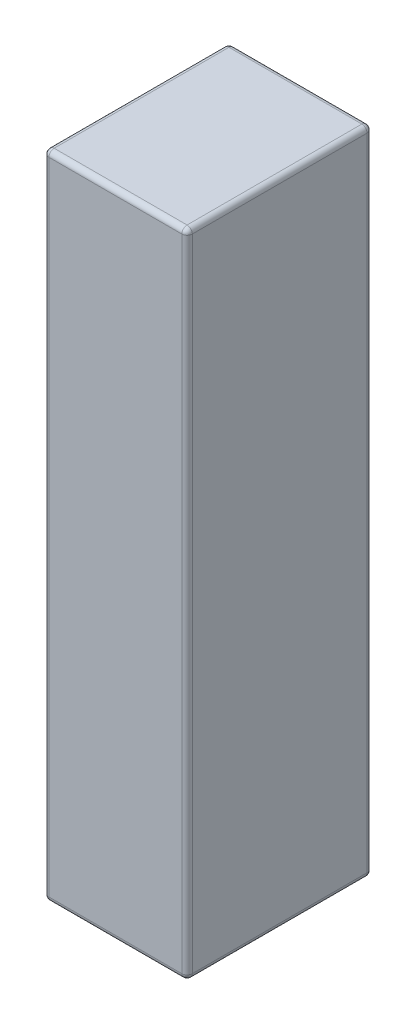
ISO-10303-21;
HEADER;
FILE_DESCRIPTION(('STEP AP214'),'2;1');
FILE_NAME('part.step','',(''),(''),'','','');
FILE_SCHEMA(('AUTOMOTIVE_DESIGN { 1 0 10303 214 1 1 1 1 }'));
ENDSEC;
DATA;
#1=APPLICATION_CONTEXT('core data for automotive mechanical design processes');
#2=APPLICATION_PROTOCOL_DEFINITION('international standard','automotive_design',2000,#1);
#3=PRODUCT_CONTEXT('',#1,'mechanical');
#4=PRODUCT('Part','Part','',(#3));
#5=PRODUCT_RELATED_PRODUCT_CATEGORY('part','',(#4));
#6=PRODUCT_DEFINITION_FORMATION('','',#4);
#7=PRODUCT_DEFINITION_CONTEXT('part definition',#1,'design');
#8=PRODUCT_DEFINITION('design','',#6,#7);
#9=PRODUCT_DEFINITION_SHAPE('','',#8);
#10=(LENGTH_UNIT() NAMED_UNIT(*) SI_UNIT(.MILLI.,.METRE.));
#11=(NAMED_UNIT(*) PLANE_ANGLE_UNIT() SI_UNIT($,.RADIAN.));
#12=(NAMED_UNIT(*) SI_UNIT($,.STERADIAN.) SOLID_ANGLE_UNIT());
#13=UNCERTAINTY_MEASURE_WITH_UNIT(LENGTH_MEASURE(1.E-05),#10,'distance_accuracy_value','');
#14=(GEOMETRIC_REPRESENTATION_CONTEXT(3) GLOBAL_UNCERTAINTY_ASSIGNED_CONTEXT((#13)) GLOBAL_UNIT_ASSIGNED_CONTEXT((#10,
#11,#12)) REPRESENTATION_CONTEXT('',''));
#15=CARTESIAN_POINT('',(0.,0.,0.));
#16=DIRECTION('',(0.,0.,1.));
#17=DIRECTION('',(1.,0.,0.));
#18=AXIS2_PLACEMENT_3D('',#15,#16,#17);
#19=CARTESIAN_POINT('',(0.,62.2,0.));
#20=DIRECTION('',(1.,0.,0.));
#21=DIRECTION('',(0.,0.,-1.));
#22=AXIS2_PLACEMENT_3D('',#19,#20,#21);
#23=PLANE('',#22);
#24=DIRECTION('',(0.,-1.,0.));
#25=VECTOR('',#24,1.);
#26=CARTESIAN_POINT('',(0.,62.2,-0.5));
#27=LINE('',#26,#25);
#28=CARTESIAN_POINT('',(0.,0.5,-0.5));
#29=VERTEX_POINT('',#28);
#30=CARTESIAN_POINT('',(0.,61.7,-0.5));
#31=VERTEX_POINT('',#30);
#32=EDGE_CURVE('E129',#29,#31,#27,.F.);
#33=ORIENTED_EDGE('',*,*,#32,.T.);
#34=DIRECTION('',(0.,0.,1.));
#35=VECTOR('',#34,1.);
#36=CARTESIAN_POINT('',(0.,61.7,0.));
#37=LINE('',#36,#35);
#38=CARTESIAN_POINT('',(0.,61.7,-17.2));
#39=VERTEX_POINT('',#38);
#40=EDGE_CURVE('E166',#31,#39,#37,.F.);
#41=ORIENTED_EDGE('',*,*,#40,.T.);
#42=DIRECTION('',(0.,-1.,0.));
#43=VECTOR('',#42,1.);
#44=CARTESIAN_POINT('',(0.,62.2,-17.2));
#45=LINE('',#44,#43);
#46=CARTESIAN_POINT('',(0.,0.5,-17.2));
#47=VERTEX_POINT('',#46);
#48=EDGE_CURVE('E163',#39,#47,#45,.T.);
#49=ORIENTED_EDGE('',*,*,#48,.T.);
#50=DIRECTION('',(0.,0.,1.));
#51=VECTOR('',#50,1.);
#52=CARTESIAN_POINT('',(0.,0.5,0.));
#53=LINE('',#52,#51);
#54=EDGE_CURVE('E158',#47,#29,#53,.T.);
#55=ORIENTED_EDGE('',*,*,#54,.T.);
#56=EDGE_LOOP('',(#33,#41,#49,#55));
#57=FACE_BOUND('',#56,.T.);
#58=ADVANCED_FACE('F34',(#57),#23,.F.);
#59=CARTESIAN_POINT('',(0.,62.2,0.));
#60=DIRECTION('',(0.,0.,-1.));
#61=DIRECTION('',(-1.,0.,0.));
#62=AXIS2_PLACEMENT_3D('',#59,#60,#61);
#63=PLANE('',#62);
#64=DIRECTION('',(0.,-1.,0.));
#65=VECTOR('',#64,1.);
#66=CARTESIAN_POINT('',(13.2,62.2,0.));
#67=LINE('',#66,#65);
#68=CARTESIAN_POINT('',(13.2,0.5,0.));
#69=VERTEX_POINT('',#68);
#70=CARTESIAN_POINT('',(13.2,61.7,0.));
#71=VERTEX_POINT('',#70);
#72=EDGE_CURVE('E151',#69,#71,#67,.F.);
#73=ORIENTED_EDGE('',*,*,#72,.T.);
#74=DIRECTION('',(1.,0.,0.));
#75=VECTOR('',#74,1.);
#76=CARTESIAN_POINT('',(0.,61.7,0.));
#77=LINE('',#76,#75);
#78=CARTESIAN_POINT('',(0.5,61.7,0.));
#79=VERTEX_POINT('',#78);
#80=EDGE_CURVE('E155',#71,#79,#77,.F.);
#81=ORIENTED_EDGE('',*,*,#80,.T.);
#82=DIRECTION('',(0.,-1.,0.));
#83=VECTOR('',#82,1.);
#84=CARTESIAN_POINT('',(0.5,62.2,0.));
#85=LINE('',#84,#83);
#86=CARTESIAN_POINT('',(0.5,0.5,0.));
#87=VERTEX_POINT('',#86);
#88=EDGE_CURVE('E127',#79,#87,#85,.T.);
#89=ORIENTED_EDGE('',*,*,#88,.T.);
#90=DIRECTION('',(1.,0.,0.));
#91=VECTOR('',#90,1.);
#92=CARTESIAN_POINT('',(13.7,0.5,0.));
#93=LINE('',#92,#91);
#94=EDGE_CURVE('E145',#87,#69,#93,.T.);
#95=ORIENTED_EDGE('',*,*,#94,.T.);
#96=EDGE_LOOP('',(#73,#81,#89,#95));
#97=FACE_BOUND('',#96,.T.);
#98=ADVANCED_FACE('F153',(#97),#63,.F.);
#99=CARTESIAN_POINT('',(13.7,62.2,0.));
#100=DIRECTION('',(-1.,0.,0.));
#101=DIRECTION('',(0.,0.,1.));
#102=AXIS2_PLACEMENT_3D('',#99,#100,#101);
#103=PLANE('',#102);
#104=DIRECTION('',(0.,-1.,0.));
#105=VECTOR('',#104,1.);
#106=CARTESIAN_POINT('',(13.7,62.2,-17.2));
#107=LINE('',#106,#105);
#108=CARTESIAN_POINT('',(13.7,0.5,-17.2));
#109=VERTEX_POINT('',#108);
#110=CARTESIAN_POINT('',(13.7,61.7,-17.2));
#111=VERTEX_POINT('',#110);
#112=EDGE_CURVE('E170',#109,#111,#107,.F.);
#113=ORIENTED_EDGE('',*,*,#112,.T.);
#114=DIRECTION('',(0.,0.,-1.));
#115=VECTOR('',#114,1.);
#116=CARTESIAN_POINT('',(13.7,61.7,0.));
#117=LINE('',#116,#115);
#118=CARTESIAN_POINT('',(13.7,61.7,-0.5));
#119=VERTEX_POINT('',#118);
#120=EDGE_CURVE('E175',#111,#119,#117,.F.);
#121=ORIENTED_EDGE('',*,*,#120,.T.);
#122=DIRECTION('',(0.,-1.,0.));
#123=VECTOR('',#122,1.);
#124=CARTESIAN_POINT('',(13.7,62.2,-0.5));
#125=LINE('',#124,#123);
#126=CARTESIAN_POINT('',(13.7,0.5,-0.5));
#127=VERTEX_POINT('',#126);
#128=EDGE_CURVE('E172',#119,#127,#125,.T.);
#129=ORIENTED_EDGE('',*,*,#128,.T.);
#130=DIRECTION('',(0.,0.,-1.));
#131=VECTOR('',#130,1.);
#132=CARTESIAN_POINT('',(13.7,0.5,-17.7));
#133=LINE('',#132,#131);
#134=EDGE_CURVE('E168',#127,#109,#133,.T.);
#135=ORIENTED_EDGE('',*,*,#134,.T.);
#136=EDGE_LOOP('',(#113,#121,#129,#135));
#137=FACE_BOUND('',#136,.T.);
#138=ADVANCED_FACE('F280',(#137),#103,.F.);
#139=CARTESIAN_POINT('',(0.,62.2,-17.7));
#140=DIRECTION('',(0.,0.,1.));
#141=DIRECTION('',(1.,0.,0.));
#142=AXIS2_PLACEMENT_3D('',#139,#140,#141);
#143=PLANE('',#142);
#144=DIRECTION('',(0.,-1.,0.));
#145=VECTOR('',#144,1.);
#146=CARTESIAN_POINT('',(0.499999999999997,62.2,-17.7));
#147=LINE('',#146,#145);
#148=CARTESIAN_POINT('',(0.499999999999997,0.5,-17.7));
#149=VERTEX_POINT('',#148);
#150=CARTESIAN_POINT('',(0.499999999999997,61.7,-17.7));
#151=VERTEX_POINT('',#150);
#152=EDGE_CURVE('E179',#149,#151,#147,.F.);
#153=ORIENTED_EDGE('',*,*,#152,.T.);
#154=DIRECTION('',(-1.,0.,0.));
#155=VECTOR('',#154,1.);
#156=CARTESIAN_POINT('',(0.,61.7,-17.7));
#157=LINE('',#156,#155);
#158=CARTESIAN_POINT('',(13.2,61.7,-17.7));
#159=VERTEX_POINT('',#158);
#160=EDGE_CURVE('E184',#151,#159,#157,.F.);
#161=ORIENTED_EDGE('',*,*,#160,.T.);
#162=DIRECTION('',(0.,-1.,0.));
#163=VECTOR('',#162,1.);
#164=CARTESIAN_POINT('',(13.2,62.2,-17.7));
#165=LINE('',#164,#163);
#166=CARTESIAN_POINT('',(13.2,0.5,-17.7));
#167=VERTEX_POINT('',#166);
#168=EDGE_CURVE('E181',#159,#167,#165,.T.);
#169=ORIENTED_EDGE('',*,*,#168,.T.);
#170=DIRECTION('',(-1.,0.,0.));
#171=VECTOR('',#170,1.);
#172=CARTESIAN_POINT('',(0.,0.5,-17.7));
#173=LINE('',#172,#171);
#174=EDGE_CURVE('E177',#167,#149,#173,.T.);
#175=ORIENTED_EDGE('',*,*,#174,.T.);
#176=EDGE_LOOP('',(#153,#161,#169,#175));
#177=FACE_BOUND('',#176,.T.);
#178=ADVANCED_FACE('F290',(#177),#143,.F.);
#179=CARTESIAN_POINT('',(0.,62.2,0.));
#180=DIRECTION('',(0.,-1.,0.));
#181=DIRECTION('',(0.,0.,-1.));
#182=AXIS2_PLACEMENT_3D('',#179,#180,#181);
#183=PLANE('',#182);
#184=DIRECTION('',(0.,0.,-1.));
#185=VECTOR('',#184,1.);
#186=CARTESIAN_POINT('',(13.2,62.2,0.));
#187=LINE('',#186,#185);
#188=CARTESIAN_POINT('',(13.2,62.2,-0.5));
#189=VERTEX_POINT('',#188);
#190=CARTESIAN_POINT('',(13.2,62.2,-17.2));
#191=VERTEX_POINT('',#190);
#192=EDGE_CURVE('E190',#189,#191,#187,.T.);
#193=ORIENTED_EDGE('',*,*,#192,.T.);
#194=DIRECTION('',(-1.,0.,0.));
#195=VECTOR('',#194,1.);
#196=CARTESIAN_POINT('',(0.,62.2,-17.2));
#197=LINE('',#196,#195);
#198=CARTESIAN_POINT('',(0.499999999999997,62.2,-17.2));
#199=VERTEX_POINT('',#198);
#200=EDGE_CURVE('E192',#191,#199,#197,.T.);
#201=ORIENTED_EDGE('',*,*,#200,.T.);
#202=DIRECTION('',(0.,0.,1.));
#203=VECTOR('',#202,1.);
#204=CARTESIAN_POINT('',(0.5,62.2,0.));
#205=LINE('',#204,#203);
#206=CARTESIAN_POINT('',(0.5,62.2,-0.5));
#207=VERTEX_POINT('',#206);
#208=EDGE_CURVE('E186',#199,#207,#205,.T.);
#209=ORIENTED_EDGE('',*,*,#208,.T.);
#210=DIRECTION('',(1.,0.,0.));
#211=VECTOR('',#210,1.);
#212=CARTESIAN_POINT('',(0.,62.2,-0.5));
#213=LINE('',#212,#211);
#214=EDGE_CURVE('E188',#207,#189,#213,.T.);
#215=ORIENTED_EDGE('',*,*,#214,.T.);
#216=EDGE_LOOP('',(#193,#201,#209,#215));
#217=FACE_BOUND('',#216,.T.);
#218=ADVANCED_FACE('F272',(#217),#183,.F.);
#219=CARTESIAN_POINT('',(0.,0.,0.));
#220=DIRECTION('',(0.,-1.,0.));
#221=DIRECTION('',(0.,0.,-1.));
#222=AXIS2_PLACEMENT_3D('',#219,#220,#221);
#223=PLANE('',#222);
#224=DIRECTION('',(0.,0.,1.));
#225=VECTOR('',#224,1.);
#226=CARTESIAN_POINT('',(0.499999999999996,0.,-17.7));
#227=LINE('',#226,#225);
#228=CARTESIAN_POINT('',(0.5,0.,-0.5));
#229=VERTEX_POINT('',#228);
#230=CARTESIAN_POINT('',(0.499999999999997,0.,-17.2));
#231=VERTEX_POINT('',#230);
#232=EDGE_CURVE('E195',#229,#231,#227,.F.);
#233=ORIENTED_EDGE('',*,*,#232,.T.);
#234=DIRECTION('',(-1.,0.,0.));
#235=VECTOR('',#234,1.);
#236=CARTESIAN_POINT('',(13.7,0.,-17.2));
#237=LINE('',#236,#235);
#238=CARTESIAN_POINT('',(13.2,0.,-17.2));
#239=VERTEX_POINT('',#238);
#240=EDGE_CURVE('E11',#231,#239,#237,.F.);
#241=ORIENTED_EDGE('',*,*,#240,.T.);
#242=DIRECTION('',(0.,0.,-1.));
#243=VECTOR('',#242,1.);
#244=CARTESIAN_POINT('',(13.2,0.,0.));
#245=LINE('',#244,#243);
#246=CARTESIAN_POINT('',(13.2,0.,-0.5));
#247=VERTEX_POINT('',#246);
#248=EDGE_CURVE('E43',#239,#247,#245,.F.);
#249=ORIENTED_EDGE('',*,*,#248,.T.);
#250=DIRECTION('',(1.,0.,0.));
#251=VECTOR('',#250,1.);
#252=CARTESIAN_POINT('',(0.,0.,-0.5));
#253=LINE('',#252,#251);
#254=EDGE_CURVE('E197',#247,#229,#253,.F.);
#255=ORIENTED_EDGE('',*,*,#254,.T.);
#256=EDGE_LOOP('',(#233,#241,#249,#255));
#257=FACE_BOUND('',#256,.T.);
#258=ADVANCED_FACE('F479',(#257),#223,.T.);
#259=CARTESIAN_POINT('',(13.2,62.2,-17.2));
#260=DIRECTION('',(0.,-1.,0.));
#261=DIRECTION('',(0.,0.,-1.));
#262=AXIS2_PLACEMENT_3D('',#259,#260,#261);
#263=CYLINDRICAL_SURFACE('',#262,0.5);
#264=CARTESIAN_POINT('',(13.2,61.7,-17.2));
#265=DIRECTION('',(0.,1.,0.));
#266=DIRECTION('',(0.,0.,1.));
#267=AXIS2_PLACEMENT_3D('',#264,#265,#266);
#268=CIRCLE('',#267,0.5);
#269=EDGE_CURVE('E38',#111,#159,#268,.T.);
#270=ORIENTED_EDGE('',*,*,#269,.F.);
#271=ORIENTED_EDGE('',*,*,#112,.F.);
#272=CARTESIAN_POINT('',(13.2,0.5,-17.2));
#273=DIRECTION('',(0.,-1.,0.));
#274=DIRECTION('',(0.,0.,-1.));
#275=AXIS2_PLACEMENT_3D('',#272,#273,#274);
#276=CIRCLE('',#275,0.5);
#277=EDGE_CURVE('E250',#167,#109,#276,.T.);
#278=ORIENTED_EDGE('',*,*,#277,.F.);
#279=ORIENTED_EDGE('',*,*,#168,.F.);
#280=EDGE_LOOP('',(#270,#271,#278,#279));
#281=FACE_BOUND('',#280,.T.);
#282=ADVANCED_FACE('F36',(#281),#263,.T.);
#283=CARTESIAN_POINT('',(13.2,61.7,-17.2));
#284=DIRECTION('',(0.,0.,-1.));
#285=DIRECTION('',(-1.,0.,0.));
#286=AXIS2_PLACEMENT_3D('',#283,#284,#285);
#287=SPHERICAL_SURFACE('',#286,0.5);
#288=CARTESIAN_POINT('',(13.2,61.7,-17.2));
#289=DIRECTION('',(0.,0.,-1.));
#290=DIRECTION('',(-1.,0.,0.));
#291=AXIS2_PLACEMENT_3D('',#288,#289,#290);
#292=CIRCLE('',#291,0.5);
#293=EDGE_CURVE('E245',#111,#191,#292,.F.);
#294=ORIENTED_EDGE('',*,*,#293,.F.);
#295=ORIENTED_EDGE('',*,*,#269,.T.);
#296=CARTESIAN_POINT('',(13.2,61.7,-17.2));
#297=DIRECTION('',(1.,0.,0.));
#298=DIRECTION('',(0.,0.,-1.));
#299=AXIS2_PLACEMENT_3D('',#296,#297,#298);
#300=CIRCLE('',#299,0.5);
#301=EDGE_CURVE('E248',#191,#159,#300,.F.);
#302=ORIENTED_EDGE('',*,*,#301,.F.);
#303=EDGE_LOOP('',(#294,#295,#302));
#304=FACE_BOUND('',#303,.T.);
#305=ADVANCED_FACE('F260',(#304),#287,.T.);
#306=CARTESIAN_POINT('',(13.2,0.5,-17.2));
#307=DIRECTION('',(1.,0.,0.));
#308=DIRECTION('',(0.,1.,0.));
#309=AXIS2_PLACEMENT_3D('',#306,#307,#308);
#310=SPHERICAL_SURFACE('',#309,0.5);
#311=CARTESIAN_POINT('',(13.2,0.5,-17.2));
#312=DIRECTION('',(1.,0.,0.));
#313=DIRECTION('',(0.,0.,-1.));
#314=AXIS2_PLACEMENT_3D('',#311,#312,#313);
#315=CIRCLE('',#314,0.5);
#316=EDGE_CURVE('E240',#167,#239,#315,.F.);
#317=ORIENTED_EDGE('',*,*,#316,.F.);
#318=ORIENTED_EDGE('',*,*,#277,.T.);
#319=CARTESIAN_POINT('',(13.2,0.5,-17.2));
#320=DIRECTION('',(0.,0.,-1.));
#321=DIRECTION('',(-1.,0.,0.));
#322=AXIS2_PLACEMENT_3D('',#319,#320,#321);
#323=CIRCLE('',#322,0.5);
#324=EDGE_CURVE('E243',#239,#109,#323,.F.);
#325=ORIENTED_EDGE('',*,*,#324,.F.);
#326=EDGE_LOOP('',(#317,#318,#325));
#327=FACE_BOUND('',#326,.T.);
#328=ADVANCED_FACE('F458',(#327),#310,.T.);
#329=CARTESIAN_POINT('',(0.,61.7,-17.2));
#330=DIRECTION('',(-1.,0.,0.));
#331=DIRECTION('',(0.,0.,1.));
#332=AXIS2_PLACEMENT_3D('',#329,#330,#331);
#333=CYLINDRICAL_SURFACE('',#332,0.5);
#334=ORIENTED_EDGE('',*,*,#301,.T.);
#335=ORIENTED_EDGE('',*,*,#160,.F.);
#336=CARTESIAN_POINT('',(0.499999999999997,61.7,-17.2));
#337=DIRECTION('',(-1.,0.,0.));
#338=DIRECTION('',(0.,0.,1.));
#339=AXIS2_PLACEMENT_3D('',#336,#337,#338);
#340=CIRCLE('',#339,0.5);
#341=EDGE_CURVE('E234',#199,#151,#340,.T.);
#342=ORIENTED_EDGE('',*,*,#341,.F.);
#343=ORIENTED_EDGE('',*,*,#200,.F.);
#344=EDGE_LOOP('',(#334,#335,#342,#343));
#345=FACE_BOUND('',#344,.T.);
#346=ADVANCED_FACE('F268',(#345),#333,.T.);
#347=CARTESIAN_POINT('',(13.2,61.7,0.));
#348=DIRECTION('',(0.,0.,-1.));
#349=DIRECTION('',(-1.,0.,0.));
#350=AXIS2_PLACEMENT_3D('',#347,#348,#349);
#351=CYLINDRICAL_SURFACE('',#350,0.5);
#352=ORIENTED_EDGE('',*,*,#293,.T.);
#353=ORIENTED_EDGE('',*,*,#192,.F.);
#354=CARTESIAN_POINT('',(13.2,61.7,-0.5));
#355=DIRECTION('',(0.,0.,1.));
#356=DIRECTION('',(1.,0.,0.));
#357=AXIS2_PLACEMENT_3D('',#354,#355,#356);
#358=CIRCLE('',#357,0.5);
#359=EDGE_CURVE('E231',#119,#189,#358,.T.);
#360=ORIENTED_EDGE('',*,*,#359,.F.);
#361=ORIENTED_EDGE('',*,*,#120,.F.);
#362=EDGE_LOOP('',(#352,#353,#360,#361));
#363=FACE_BOUND('',#362,.T.);
#364=ADVANCED_FACE('F277',(#363),#351,.T.);
#365=CARTESIAN_POINT('',(13.2,62.2,-0.5));
#366=DIRECTION('',(0.,-1.,0.));
#367=DIRECTION('',(0.,0.,-1.));
#368=AXIS2_PLACEMENT_3D('',#365,#366,#367);
#369=CYLINDRICAL_SURFACE('',#368,0.5);
#370=CARTESIAN_POINT('',(13.2,0.5,-0.5));
#371=DIRECTION('',(0.,-1.,0.));
#372=DIRECTION('',(0.,0.,-1.));
#373=AXIS2_PLACEMENT_3D('',#370,#371,#372);
#374=CIRCLE('',#373,0.5);
#375=EDGE_CURVE('E225',#127,#69,#374,.T.);
#376=ORIENTED_EDGE('',*,*,#375,.F.);
#377=ORIENTED_EDGE('',*,*,#128,.F.);
#378=CARTESIAN_POINT('',(13.2,61.7,-0.5));
#379=DIRECTION('',(0.,1.,0.));
#380=DIRECTION('',(0.,0.,1.));
#381=AXIS2_PLACEMENT_3D('',#378,#379,#380);
#382=CIRCLE('',#381,0.5);
#383=EDGE_CURVE('E228',#71,#119,#382,.T.);
#384=ORIENTED_EDGE('',*,*,#383,.F.);
#385=ORIENTED_EDGE('',*,*,#72,.F.);
#386=EDGE_LOOP('',(#376,#377,#384,#385));
#387=FACE_BOUND('',#386,.T.);
#388=ADVANCED_FACE('F284',(#387),#369,.T.);
#389=CARTESIAN_POINT('',(13.2,0.5,0.));
#390=DIRECTION('',(0.,0.,1.));
#391=DIRECTION('',(1.,0.,0.));
#392=AXIS2_PLACEMENT_3D('',#389,#390,#391);
#393=CYLINDRICAL_SURFACE('',#392,0.5);
#394=ORIENTED_EDGE('',*,*,#324,.T.);
#395=ORIENTED_EDGE('',*,*,#134,.F.);
#396=CARTESIAN_POINT('',(13.2,0.5,-0.5));
#397=DIRECTION('',(0.,0.,1.));
#398=DIRECTION('',(1.,0.,0.));
#399=AXIS2_PLACEMENT_3D('',#396,#397,#398);
#400=CIRCLE('',#399,0.5);
#401=EDGE_CURVE('E223',#247,#127,#400,.T.);
#402=ORIENTED_EDGE('',*,*,#401,.F.);
#403=ORIENTED_EDGE('',*,*,#248,.F.);
#404=EDGE_LOOP('',(#394,#395,#402,#403));
#405=FACE_BOUND('',#404,.T.);
#406=ADVANCED_FACE('F288',(#405),#393,.T.);
#407=CARTESIAN_POINT('',(0.,0.5,-17.2));
#408=DIRECTION('',(1.,0.,0.));
#409=DIRECTION('',(0.,0.,-1.));
#410=AXIS2_PLACEMENT_3D('',#407,#408,#409);
#411=CYLINDRICAL_SURFACE('',#410,0.5);
#412=ORIENTED_EDGE('',*,*,#316,.T.);
#413=ORIENTED_EDGE('',*,*,#240,.F.);
#414=CARTESIAN_POINT('',(0.499999999999997,0.5,-17.2));
#415=DIRECTION('',(-1.,0.,0.));
#416=DIRECTION('',(0.,0.,1.));
#417=AXIS2_PLACEMENT_3D('',#414,#415,#416);
#418=CIRCLE('',#417,0.5);
#419=EDGE_CURVE('E220',#149,#231,#418,.T.);
#420=ORIENTED_EDGE('',*,*,#419,.F.);
#421=ORIENTED_EDGE('',*,*,#174,.F.);
#422=EDGE_LOOP('',(#412,#413,#420,#421));
#423=FACE_BOUND('',#422,.T.);
#424=ADVANCED_FACE('F300',(#423),#411,.T.);
#425=CARTESIAN_POINT('',(0.499999999999997,62.2,-17.2));
#426=DIRECTION('',(0.,-1.,0.));
#427=DIRECTION('',(0.,0.,-1.));
#428=AXIS2_PLACEMENT_3D('',#425,#426,#427);
#429=CYLINDRICAL_SURFACE('',#428,0.5);
#430=CARTESIAN_POINT('',(0.499999999999997,61.7,-17.2));
#431=DIRECTION('',(0.,1.,0.));
#432=DIRECTION('',(0.,0.,1.));
#433=AXIS2_PLACEMENT_3D('',#430,#431,#432);
#434=CIRCLE('',#433,0.5);
#435=EDGE_CURVE('E237',#151,#39,#434,.T.);
#436=ORIENTED_EDGE('',*,*,#435,.F.);
#437=ORIENTED_EDGE('',*,*,#152,.F.);
#438=CARTESIAN_POINT('',(0.499999999999997,0.5,-17.2));
#439=DIRECTION('',(0.,-1.,0.));
#440=DIRECTION('',(0.,0.,-1.));
#441=AXIS2_PLACEMENT_3D('',#438,#439,#440);
#442=CIRCLE('',#441,0.5);
#443=EDGE_CURVE('E217',#47,#149,#442,.T.);
#444=ORIENTED_EDGE('',*,*,#443,.F.);
#445=ORIENTED_EDGE('',*,*,#48,.F.);
#446=EDGE_LOOP('',(#436,#437,#444,#445));
#447=FACE_BOUND('',#446,.T.);
#448=ADVANCED_FACE('F295',(#447),#429,.T.);
#449=CARTESIAN_POINT('',(0.499999999999997,61.7,-17.2));
#450=DIRECTION('',(0.,0.,-1.));
#451=DIRECTION('',(-1.,0.,0.));
#452=AXIS2_PLACEMENT_3D('',#449,#450,#451);
#453=SPHERICAL_SURFACE('',#452,0.5);
#454=ORIENTED_EDGE('',*,*,#341,.T.);
#455=ORIENTED_EDGE('',*,*,#435,.T.);
#456=CARTESIAN_POINT('',(0.499999999999997,61.7,-17.2));
#457=DIRECTION('',(0.,0.,-1.));
#458=DIRECTION('',(-1.,0.,0.));
#459=AXIS2_PLACEMENT_3D('',#456,#457,#458);
#460=CIRCLE('',#459,0.5);
#461=EDGE_CURVE('E214',#199,#39,#460,.F.);
#462=ORIENTED_EDGE('',*,*,#461,.F.);
#463=EDGE_LOOP('',(#454,#455,#462));
#464=FACE_BOUND('',#463,.T.);
#465=ADVANCED_FACE('F311',(#464),#453,.T.);
#466=CARTESIAN_POINT('',(13.2,61.7,-0.5));
#467=DIRECTION('',(1.,0.,0.));
#468=DIRECTION('',(0.,0.,-1.));
#469=AXIS2_PLACEMENT_3D('',#466,#467,#468);
#470=SPHERICAL_SURFACE('',#469,0.5);
#471=ORIENTED_EDGE('',*,*,#383,.T.);
#472=ORIENTED_EDGE('',*,*,#359,.T.);
#473=CARTESIAN_POINT('',(13.2,61.7,-0.5));
#474=DIRECTION('',(1.,0.,0.));
#475=DIRECTION('',(0.,0.,-1.));
#476=AXIS2_PLACEMENT_3D('',#473,#474,#475);
#477=CIRCLE('',#476,0.5);
#478=EDGE_CURVE('E211',#71,#189,#477,.F.);
#479=ORIENTED_EDGE('',*,*,#478,.F.);
#480=EDGE_LOOP('',(#471,#472,#479));
#481=FACE_BOUND('',#480,.T.);
#482=ADVANCED_FACE('F321',(#481),#470,.T.);
#483=CARTESIAN_POINT('',(13.2,0.5,-0.5));
#484=DIRECTION('',(1.,0.,0.));
#485=DIRECTION('',(0.,1.,0.));
#486=AXIS2_PLACEMENT_3D('',#483,#484,#485);
#487=SPHERICAL_SURFACE('',#486,0.5);
#488=ORIENTED_EDGE('',*,*,#401,.T.);
#489=ORIENTED_EDGE('',*,*,#375,.T.);
#490=CARTESIAN_POINT('',(13.2,0.5,-0.5));
#491=DIRECTION('',(1.,0.,0.));
#492=DIRECTION('',(0.,0.,-1.));
#493=AXIS2_PLACEMENT_3D('',#490,#491,#492);
#494=CIRCLE('',#493,0.5);
#495=EDGE_CURVE('E148',#247,#69,#494,.F.);
#496=ORIENTED_EDGE('',*,*,#495,.F.);
#497=EDGE_LOOP('',(#488,#489,#496));
#498=FACE_BOUND('',#497,.T.);
#499=ADVANCED_FACE('F323',(#498),#487,.T.);
#500=CARTESIAN_POINT('',(0.499999999999997,0.5,-17.2));
#501=DIRECTION('',(0.,0.,-1.));
#502=DIRECTION('',(0.,1.,0.));
#503=AXIS2_PLACEMENT_3D('',#500,#501,#502);
#504=SPHERICAL_SURFACE('',#503,0.5);
#505=ORIENTED_EDGE('',*,*,#443,.T.);
#506=ORIENTED_EDGE('',*,*,#419,.T.);
#507=CARTESIAN_POINT('',(0.499999999999997,0.5,-17.2));
#508=DIRECTION('',(0.,0.,-1.));
#509=DIRECTION('',(-1.,0.,0.));
#510=AXIS2_PLACEMENT_3D('',#507,#508,#509);
#511=CIRCLE('',#510,0.5);
#512=EDGE_CURVE('E207',#47,#231,#511,.F.);
#513=ORIENTED_EDGE('',*,*,#512,.F.);
#514=EDGE_LOOP('',(#505,#506,#513));
#515=FACE_BOUND('',#514,.T.);
#516=ADVANCED_FACE('F302',(#515),#504,.T.);
#517=CARTESIAN_POINT('',(0.5,61.7,0.));
#518=DIRECTION('',(0.,0.,1.));
#519=DIRECTION('',(1.,0.,0.));
#520=AXIS2_PLACEMENT_3D('',#517,#518,#519);
#521=CYLINDRICAL_SURFACE('',#520,0.5);
#522=ORIENTED_EDGE('',*,*,#461,.T.);
#523=ORIENTED_EDGE('',*,*,#40,.F.);
#524=CARTESIAN_POINT('',(0.5,61.7,-0.5));
#525=DIRECTION('',(0.,0.,1.));
#526=DIRECTION('',(1.,0.,0.));
#527=AXIS2_PLACEMENT_3D('',#524,#525,#526);
#528=CIRCLE('',#527,0.5);
#529=EDGE_CURVE('E204',#207,#31,#528,.T.);
#530=ORIENTED_EDGE('',*,*,#529,.F.);
#531=ORIENTED_EDGE('',*,*,#208,.F.);
#532=EDGE_LOOP('',(#522,#523,#530,#531));
#533=FACE_BOUND('',#532,.T.);
#534=ADVANCED_FACE('F313',(#533),#521,.T.);
#535=CARTESIAN_POINT('',(0.,61.7,-0.5));
#536=DIRECTION('',(1.,0.,0.));
#537=DIRECTION('',(0.,0.,-1.));
#538=AXIS2_PLACEMENT_3D('',#535,#536,#537);
#539=CYLINDRICAL_SURFACE('',#538,0.5);
#540=ORIENTED_EDGE('',*,*,#478,.T.);
#541=ORIENTED_EDGE('',*,*,#214,.F.);
#542=CARTESIAN_POINT('',(0.5,61.7,-0.5));
#543=DIRECTION('',(-1.,0.,0.));
#544=DIRECTION('',(0.,0.,1.));
#545=AXIS2_PLACEMENT_3D('',#542,#543,#544);
#546=CIRCLE('',#545,0.5);
#547=EDGE_CURVE('E142',#79,#207,#546,.T.);
#548=ORIENTED_EDGE('',*,*,#547,.F.);
#549=ORIENTED_EDGE('',*,*,#80,.F.);
#550=EDGE_LOOP('',(#540,#541,#548,#549));
#551=FACE_BOUND('',#550,.T.);
#552=ADVANCED_FACE('F319',(#551),#539,.T.);
#553=CARTESIAN_POINT('',(0.,0.5,-0.5));
#554=DIRECTION('',(-1.,0.,0.));
#555=DIRECTION('',(0.,0.,1.));
#556=AXIS2_PLACEMENT_3D('',#553,#554,#555);
#557=CYLINDRICAL_SURFACE('',#556,0.5);
#558=ORIENTED_EDGE('',*,*,#495,.T.);
#559=ORIENTED_EDGE('',*,*,#94,.F.);
#560=CARTESIAN_POINT('',(0.5,0.5,-0.5));
#561=DIRECTION('',(-1.,0.,0.));
#562=DIRECTION('',(0.,0.,1.));
#563=AXIS2_PLACEMENT_3D('',#560,#561,#562);
#564=CIRCLE('',#563,0.5);
#565=EDGE_CURVE('E135',#229,#87,#564,.T.);
#566=ORIENTED_EDGE('',*,*,#565,.F.);
#567=ORIENTED_EDGE('',*,*,#254,.F.);
#568=EDGE_LOOP('',(#558,#559,#566,#567));
#569=FACE_BOUND('',#568,.T.);
#570=ADVANCED_FACE('F146',(#569),#557,.T.);
#571=CARTESIAN_POINT('',(0.5,0.5,0.));
#572=DIRECTION('',(0.,0.,-1.));
#573=DIRECTION('',(-1.,0.,0.));
#574=AXIS2_PLACEMENT_3D('',#571,#572,#573);
#575=CYLINDRICAL_SURFACE('',#574,0.5);
#576=ORIENTED_EDGE('',*,*,#512,.T.);
#577=ORIENTED_EDGE('',*,*,#232,.F.);
#578=CARTESIAN_POINT('',(0.5,0.5,-0.5));
#579=DIRECTION('',(0.,0.,1.));
#580=DIRECTION('',(1.,0.,0.));
#581=AXIS2_PLACEMENT_3D('',#578,#579,#580);
#582=CIRCLE('',#581,0.5);
#583=EDGE_CURVE('E139',#29,#229,#582,.T.);
#584=ORIENTED_EDGE('',*,*,#583,.F.);
#585=ORIENTED_EDGE('',*,*,#54,.F.);
#586=EDGE_LOOP('',(#576,#577,#584,#585));
#587=FACE_BOUND('',#586,.T.);
#588=ADVANCED_FACE('F306',(#587),#575,.T.);
#589=CARTESIAN_POINT('',(0.5,61.7,-0.5));
#590=DIRECTION('',(0.,1.,0.));
#591=DIRECTION('',(0.,0.,1.));
#592=AXIS2_PLACEMENT_3D('',#589,#590,#591);
#593=SPHERICAL_SURFACE('',#592,0.5);
#594=ORIENTED_EDGE('',*,*,#547,.T.);
#595=ORIENTED_EDGE('',*,*,#529,.T.);
#596=CARTESIAN_POINT('',(0.5,61.7,-0.5));
#597=DIRECTION('',(0.,1.,0.));
#598=DIRECTION('',(0.,0.,1.));
#599=AXIS2_PLACEMENT_3D('',#596,#597,#598);
#600=CIRCLE('',#599,0.5);
#601=EDGE_CURVE('E132',#79,#31,#600,.F.);
#602=ORIENTED_EDGE('',*,*,#601,.F.);
#603=EDGE_LOOP('',(#594,#595,#602));
#604=FACE_BOUND('',#603,.T.);
#605=ADVANCED_FACE('F317',(#604),#593,.T.);
#606=CARTESIAN_POINT('',(0.5,0.5,-0.5));
#607=DIRECTION('',(0.,-1.,0.));
#608=DIRECTION('',(0.,0.,-1.));
#609=AXIS2_PLACEMENT_3D('',#606,#607,#608);
#610=SPHERICAL_SURFACE('',#609,0.5);
#611=ORIENTED_EDGE('',*,*,#583,.T.);
#612=ORIENTED_EDGE('',*,*,#565,.T.);
#613=CARTESIAN_POINT('',(0.5,0.5,-0.5));
#614=DIRECTION('',(0.,-1.,0.));
#615=DIRECTION('',(0.,0.,-1.));
#616=AXIS2_PLACEMENT_3D('',#613,#614,#615);
#617=CIRCLE('',#616,0.5);
#618=EDGE_CURVE('E123',#29,#87,#617,.F.);
#619=ORIENTED_EDGE('',*,*,#618,.F.);
#620=EDGE_LOOP('',(#611,#612,#619));
#621=FACE_BOUND('',#620,.T.);
#622=ADVANCED_FACE('F137',(#621),#610,.T.);
#623=CARTESIAN_POINT('',(0.5,62.2,-0.5));
#624=DIRECTION('',(0.,-1.,0.));
#625=DIRECTION('',(0.,0.,-1.));
#626=AXIS2_PLACEMENT_3D('',#623,#624,#625);
#627=CYLINDRICAL_SURFACE('',#626,0.5);
#628=ORIENTED_EDGE('',*,*,#601,.T.);
#629=ORIENTED_EDGE('',*,*,#32,.F.);
#630=ORIENTED_EDGE('',*,*,#618,.T.);
#631=ORIENTED_EDGE('',*,*,#88,.F.);
#632=EDGE_LOOP('',(#628,#629,#630,#631));
#633=FACE_BOUND('',#632,.T.);
#634=ADVANCED_FACE('F125',(#633),#627,.T.);
#635=CLOSED_SHELL('',(#58,#98,#138,#178,#218,#258,#282,#305,#328,#346,#364,#388,#406,#424,#448,
#465,#482,#499,#516,#534,#552,#570,#588,#605,#622,#634));
#636=MANIFOLD_SOLID_BREP('B2',#635);
#637=ADVANCED_BREP_SHAPE_REPRESENTATION('',(#18,#636),#14);
#638=SHAPE_DEFINITION_REPRESENTATION(#9,#637);
ENDSEC;
END-ISO-10303-21;
